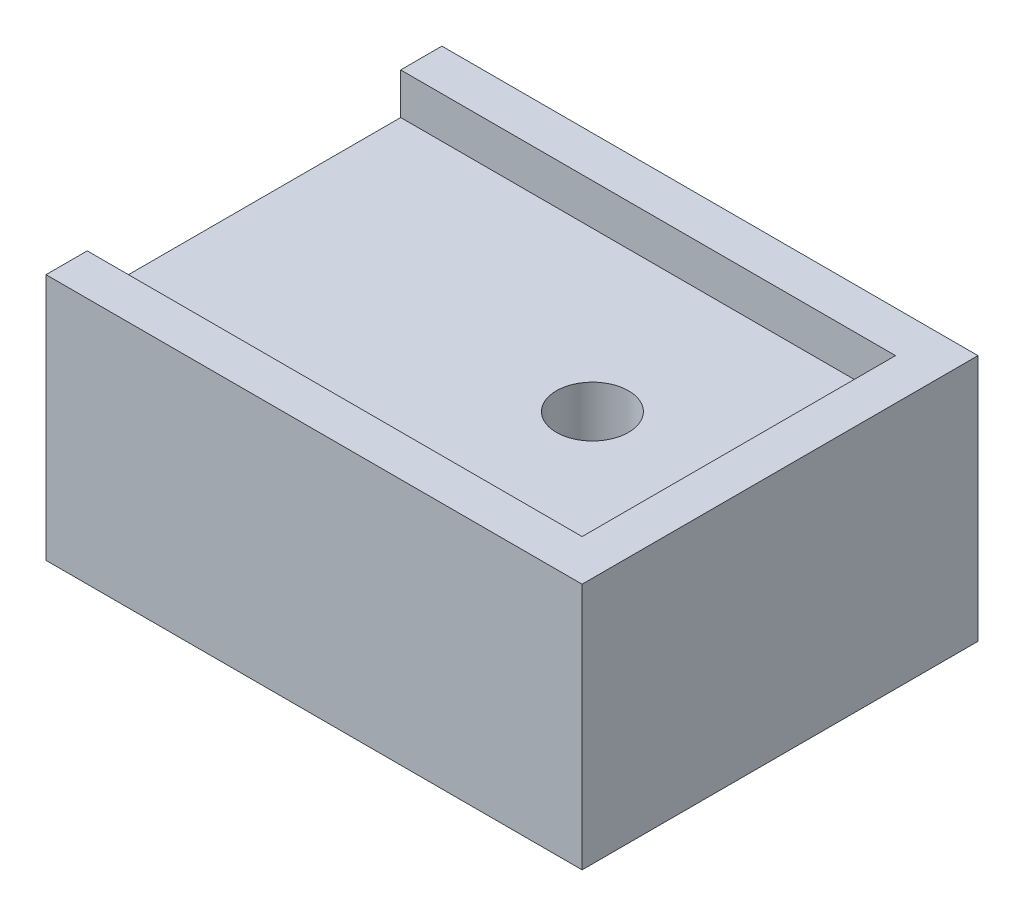
ISO-10303-21;
HEADER;
FILE_DESCRIPTION(('STEP AP214'),'2;1');
FILE_NAME('part.step','',(''),(''),'','','');
FILE_SCHEMA(('AUTOMOTIVE_DESIGN { 1 0 10303 214 1 1 1 1 }'));
ENDSEC;
DATA;
#1=APPLICATION_CONTEXT('core data for automotive mechanical design processes');
#2=APPLICATION_PROTOCOL_DEFINITION('international standard','automotive_design',2000,#1);
#3=PRODUCT_CONTEXT('',#1,'mechanical');
#4=PRODUCT('Part','Part','',(#3));
#5=PRODUCT_RELATED_PRODUCT_CATEGORY('part','',(#4));
#6=PRODUCT_DEFINITION_FORMATION('','',#4);
#7=PRODUCT_DEFINITION_CONTEXT('part definition',#1,'design');
#8=PRODUCT_DEFINITION('design','',#6,#7);
#9=PRODUCT_DEFINITION_SHAPE('','',#8);
#10=(LENGTH_UNIT() NAMED_UNIT(*) SI_UNIT(.MILLI.,.METRE.));
#11=(NAMED_UNIT(*) PLANE_ANGLE_UNIT() SI_UNIT($,.RADIAN.));
#12=(NAMED_UNIT(*) SI_UNIT($,.STERADIAN.) SOLID_ANGLE_UNIT());
#13=UNCERTAINTY_MEASURE_WITH_UNIT(LENGTH_MEASURE(1.E-05),#10,'distance_accuracy_value','');
#14=(GEOMETRIC_REPRESENTATION_CONTEXT(3) GLOBAL_UNCERTAINTY_ASSIGNED_CONTEXT((#13)) GLOBAL_UNIT_ASSIGNED_CONTEXT((#10,
#11,#12)) REPRESENTATION_CONTEXT('',''));
#15=CARTESIAN_POINT('',(0.,0.,0.));
#16=DIRECTION('',(0.,0.,1.));
#17=DIRECTION('',(1.,0.,0.));
#18=AXIS2_PLACEMENT_3D('',#15,#16,#17);
#19=CARTESIAN_POINT('',(-12.,10.,7.6));
#20=DIRECTION('',(1.,0.,0.));
#21=DIRECTION('',(0.,0.,-1.));
#22=AXIS2_PLACEMENT_3D('',#19,#20,#21);
#23=PLANE('',#22);
#24=DIRECTION('',(0.,0.,1.));
#25=VECTOR('',#24,1.);
#26=CARTESIAN_POINT('',(-12.,0.,7.6));
#27=LINE('',#26,#25);
#28=CARTESIAN_POINT('',(-12.,0.,-9.6));
#29=VERTEX_POINT('',#28);
#30=CARTESIAN_POINT('',(-12.,0.,9.6));
#31=VERTEX_POINT('',#30);
#32=EDGE_CURVE('E42',#29,#31,#27,.T.);
#33=ORIENTED_EDGE('',*,*,#32,.T.);
#34=DIRECTION('',(0.,-1.,0.));
#35=VECTOR('',#34,1.);
#36=CARTESIAN_POINT('',(-12.,12.,9.6));
#37=LINE('',#36,#35);
#38=CARTESIAN_POINT('',(-12.,12.,9.6));
#39=VERTEX_POINT('',#38);
#40=EDGE_CURVE('E165',#39,#31,#37,.T.);
#41=ORIENTED_EDGE('',*,*,#40,.F.);
#42=DIRECTION('',(0.,0.,-1.));
#43=VECTOR('',#42,1.);
#44=CARTESIAN_POINT('',(-12.,12.,9.6));
#45=LINE('',#44,#43);
#46=CARTESIAN_POINT('',(-12.,12.,7.6));
#47=VERTEX_POINT('',#46);
#48=EDGE_CURVE('E110',#39,#47,#45,.T.);
#49=ORIENTED_EDGE('',*,*,#48,.T.);
#50=DIRECTION('',(0.,-1.,0.));
#51=VECTOR('',#50,1.);
#52=CARTESIAN_POINT('',(-12.,12.,7.6));
#53=LINE('',#52,#51);
#54=CARTESIAN_POINT('',(-12.,10.,7.6));
#55=VERTEX_POINT('',#54);
#56=EDGE_CURVE('E126',#47,#55,#53,.T.);
#57=ORIENTED_EDGE('',*,*,#56,.T.);
#58=DIRECTION('',(0.,0.,1.));
#59=VECTOR('',#58,1.);
#60=CARTESIAN_POINT('',(-12.,10.,7.6));
#61=LINE('',#60,#59);
#62=CARTESIAN_POINT('',(-12.,10.,-7.6));
#63=VERTEX_POINT('',#62);
#64=EDGE_CURVE('E48',#63,#55,#61,.T.);
#65=ORIENTED_EDGE('',*,*,#64,.F.);
#66=DIRECTION('',(0.,-1.,0.));
#67=VECTOR('',#66,1.);
#68=CARTESIAN_POINT('',(-12.,12.,-7.6));
#69=LINE('',#68,#67);
#70=CARTESIAN_POINT('',(-12.,12.,-7.6));
#71=VERTEX_POINT('',#70);
#72=EDGE_CURVE('E179',#71,#63,#69,.T.);
#73=ORIENTED_EDGE('',*,*,#72,.F.);
#74=DIRECTION('',(0.,0.,-1.));
#75=VECTOR('',#74,1.);
#76=CARTESIAN_POINT('',(-12.,12.,-7.6));
#77=LINE('',#76,#75);
#78=CARTESIAN_POINT('',(-12.,12.,-9.6));
#79=VERTEX_POINT('',#78);
#80=EDGE_CURVE('E137',#71,#79,#77,.T.);
#81=ORIENTED_EDGE('',*,*,#80,.T.);
#82=DIRECTION('',(0.,-1.,0.));
#83=VECTOR('',#82,1.);
#84=CARTESIAN_POINT('',(-12.,12.,-9.6));
#85=LINE('',#84,#83);
#86=EDGE_CURVE('E175',#79,#29,#85,.T.);
#87=ORIENTED_EDGE('',*,*,#86,.T.);
#88=EDGE_LOOP('',(#33,#41,#49,#57,#65,#73,#81,#87));
#89=FACE_BOUND('',#88,.T.);
#90=ADVANCED_FACE('F39',(#89),#23,.F.);
#91=CARTESIAN_POINT('',(0.,10.,0.));
#92=DIRECTION('',(0.,-1.,0.));
#93=DIRECTION('',(0.,0.,-1.));
#94=AXIS2_PLACEMENT_3D('',#91,#92,#93);
#95=PLANE('',#94);
#96=CARTESIAN_POINT('',(4.99999999999999,10.,0.0999999999999812));
#97=DIRECTION('',(0.,1.,0.));
#98=DIRECTION('',(0.,0.,1.));
#99=AXIS2_PLACEMENT_3D('',#96,#97,#98);
#100=CIRCLE('',#99,1.75);
#101=CARTESIAN_POINT('',(4.99999999999999,10.,1.84999999999998));
#102=VERTEX_POINT('',#101);
#103=EDGE_CURVE('E164',#102,#102,#100,.T.);
#104=ORIENTED_EDGE('',*,*,#103,.F.);
#105=EDGE_LOOP('',(#104));
#106=FACE_BOUND('',#105,.T.);
#107=DIRECTION('',(0.,0.,-1.));
#108=VECTOR('',#107,1.);
#109=CARTESIAN_POINT('',(12.,10.,7.6));
#110=LINE('',#109,#108);
#111=CARTESIAN_POINT('',(12.,10.,7.6));
#112=VERTEX_POINT('',#111);
#113=CARTESIAN_POINT('',(12.,10.,-7.6));
#114=VERTEX_POINT('',#113);
#115=EDGE_CURVE('E105',#112,#114,#110,.T.);
#116=ORIENTED_EDGE('',*,*,#115,.T.);
#117=DIRECTION('',(-1.,0.,0.));
#118=VECTOR('',#117,1.);
#119=CARTESIAN_POINT('',(-12.,10.,-7.6));
#120=LINE('',#119,#118);
#121=EDGE_CURVE('E194',#114,#63,#120,.T.);
#122=ORIENTED_EDGE('',*,*,#121,.T.);
#123=ORIENTED_EDGE('',*,*,#64,.T.);
#124=DIRECTION('',(1.,0.,0.));
#125=VECTOR('',#124,1.);
#126=CARTESIAN_POINT('',(-12.,10.,7.6));
#127=LINE('',#126,#125);
#128=EDGE_CURVE('E11',#55,#112,#127,.T.);
#129=ORIENTED_EDGE('',*,*,#128,.T.);
#130=EDGE_LOOP('',(#116,#122,#123,#129));
#131=FACE_BOUND('',#130,.T.);
#132=ADVANCED_FACE('F216',(#106,#131),#95,.F.);
#133=CARTESIAN_POINT('',(0.,0.,0.));
#134=DIRECTION('',(0.,-1.,0.));
#135=DIRECTION('',(0.,0.,-1.));
#136=AXIS2_PLACEMENT_3D('',#133,#134,#135);
#137=PLANE('',#136);
#138=ORIENTED_EDGE('',*,*,#32,.F.);
#139=DIRECTION('',(1.,0.,0.));
#140=VECTOR('',#139,1.);
#141=CARTESIAN_POINT('',(14.,0.,-9.6));
#142=LINE('',#141,#140);
#143=CARTESIAN_POINT('',(14.,0.,-9.6));
#144=VERTEX_POINT('',#143);
#145=EDGE_CURVE('E155',#29,#144,#142,.T.);
#146=ORIENTED_EDGE('',*,*,#145,.T.);
#147=DIRECTION('',(0.,0.,1.));
#148=VECTOR('',#147,1.);
#149=CARTESIAN_POINT('',(14.,0.,9.6));
#150=LINE('',#149,#148);
#151=CARTESIAN_POINT('',(14.,0.,9.6));
#152=VERTEX_POINT('',#151);
#153=EDGE_CURVE('E132',#144,#152,#150,.T.);
#154=ORIENTED_EDGE('',*,*,#153,.T.);
#155=DIRECTION('',(-1.,0.,0.));
#156=VECTOR('',#155,1.);
#157=CARTESIAN_POINT('',(-12.,0.,9.6));
#158=LINE('',#157,#156);
#159=EDGE_CURVE('E128',#152,#31,#158,.T.);
#160=ORIENTED_EDGE('',*,*,#159,.T.);
#161=EDGE_LOOP('',(#138,#146,#154,#160));
#162=FACE_BOUND('',#161,.T.);
#163=CARTESIAN_POINT('',(4.99999999999999,0.,0.0999999999999812));
#164=DIRECTION('',(0.,1.,0.));
#165=DIRECTION('',(0.,0.,1.));
#166=AXIS2_PLACEMENT_3D('',#163,#164,#165);
#167=CIRCLE('',#166,1.75);
#168=CARTESIAN_POINT('',(4.99999999999999,0.,1.84999999999998));
#169=VERTEX_POINT('',#168);
#170=EDGE_CURVE('E185',#169,#169,#167,.T.);
#171=ORIENTED_EDGE('',*,*,#170,.T.);
#172=EDGE_LOOP('',(#171));
#173=FACE_BOUND('',#172,.T.);
#174=ADVANCED_FACE('F206',(#162,#173),#137,.T.);
#175=CARTESIAN_POINT('',(4.99999999999999,0.,0.0999999999999812));
#176=DIRECTION('',(0.,1.,0.));
#177=DIRECTION('',(0.,0.,1.));
#178=AXIS2_PLACEMENT_3D('',#175,#176,#177);
#179=CYLINDRICAL_SURFACE('',#178,1.75);
#180=ORIENTED_EDGE('',*,*,#170,.F.);
#181=EDGE_LOOP('',(#180));
#182=FACE_BOUND('',#181,.T.);
#183=ORIENTED_EDGE('',*,*,#103,.T.);
#184=EDGE_LOOP('',(#183));
#185=FACE_BOUND('',#184,.T.);
#186=ADVANCED_FACE('F224',(#182,#185),#179,.F.);
#187=CARTESIAN_POINT('',(-12.,12.,7.6));
#188=DIRECTION('',(0.,0.,-1.));
#189=DIRECTION('',(-1.,0.,0.));
#190=AXIS2_PLACEMENT_3D('',#187,#188,#189);
#191=PLANE('',#190);
#192=ORIENTED_EDGE('',*,*,#128,.F.);
#193=ORIENTED_EDGE('',*,*,#56,.F.);
#194=DIRECTION('',(1.,0.,0.));
#195=VECTOR('',#194,1.);
#196=CARTESIAN_POINT('',(-12.,12.,7.6));
#197=LINE('',#196,#195);
#198=CARTESIAN_POINT('',(12.,12.,7.6));
#199=VERTEX_POINT('',#198);
#200=EDGE_CURVE('E117',#47,#199,#197,.T.);
#201=ORIENTED_EDGE('',*,*,#200,.T.);
#202=DIRECTION('',(0.,-1.,0.));
#203=VECTOR('',#202,1.);
#204=CARTESIAN_POINT('',(12.,12.,7.6));
#205=LINE('',#204,#203);
#206=EDGE_CURVE('E100',#199,#112,#205,.T.);
#207=ORIENTED_EDGE('',*,*,#206,.T.);
#208=EDGE_LOOP('',(#192,#193,#201,#207));
#209=FACE_BOUND('',#208,.T.);
#210=ADVANCED_FACE('F124',(#209),#191,.T.);
#211=CARTESIAN_POINT('',(12.,12.,-7.6));
#212=DIRECTION('',(0.,0.,1.));
#213=DIRECTION('',(1.,0.,0.));
#214=AXIS2_PLACEMENT_3D('',#211,#212,#213);
#215=PLANE('',#214);
#216=ORIENTED_EDGE('',*,*,#121,.F.);
#217=DIRECTION('',(0.,-1.,0.));
#218=VECTOR('',#217,1.);
#219=CARTESIAN_POINT('',(12.,12.,-7.6));
#220=LINE('',#219,#218);
#221=CARTESIAN_POINT('',(12.,12.,-7.6));
#222=VERTEX_POINT('',#221);
#223=EDGE_CURVE('E109',#222,#114,#220,.T.);
#224=ORIENTED_EDGE('',*,*,#223,.F.);
#225=DIRECTION('',(-1.,0.,0.));
#226=VECTOR('',#225,1.);
#227=CARTESIAN_POINT('',(12.,12.,-7.6));
#228=LINE('',#227,#226);
#229=EDGE_CURVE('E121',#222,#71,#228,.T.);
#230=ORIENTED_EDGE('',*,*,#229,.T.);
#231=ORIENTED_EDGE('',*,*,#72,.T.);
#232=EDGE_LOOP('',(#216,#224,#230,#231));
#233=FACE_BOUND('',#232,.T.);
#234=ADVANCED_FACE('F215',(#233),#215,.T.);
#235=CARTESIAN_POINT('',(12.,12.,7.6));
#236=DIRECTION('',(-1.,0.,0.));
#237=DIRECTION('',(0.,0.,1.));
#238=AXIS2_PLACEMENT_3D('',#235,#236,#237);
#239=PLANE('',#238);
#240=ORIENTED_EDGE('',*,*,#115,.F.);
#241=ORIENTED_EDGE('',*,*,#206,.F.);
#242=DIRECTION('',(0.,0.,-1.));
#243=VECTOR('',#242,1.);
#244=CARTESIAN_POINT('',(12.,12.,7.6));
#245=LINE('',#244,#243);
#246=EDGE_CURVE('E104',#199,#222,#245,.T.);
#247=ORIENTED_EDGE('',*,*,#246,.T.);
#248=ORIENTED_EDGE('',*,*,#223,.T.);
#249=EDGE_LOOP('',(#240,#241,#247,#248));
#250=FACE_BOUND('',#249,.T.);
#251=ADVANCED_FACE('F102',(#250),#239,.T.);
#252=CARTESIAN_POINT('',(-12.,12.,9.6));
#253=DIRECTION('',(0.,0.,1.));
#254=DIRECTION('',(1.,0.,0.));
#255=AXIS2_PLACEMENT_3D('',#252,#253,#254);
#256=PLANE('',#255);
#257=ORIENTED_EDGE('',*,*,#159,.F.);
#258=DIRECTION('',(0.,-1.,0.));
#259=VECTOR('',#258,1.);
#260=CARTESIAN_POINT('',(14.,12.,9.6));
#261=LINE('',#260,#259);
#262=CARTESIAN_POINT('',(14.,12.,9.6));
#263=VERTEX_POINT('',#262);
#264=EDGE_CURVE('E169',#263,#152,#261,.T.);
#265=ORIENTED_EDGE('',*,*,#264,.F.);
#266=DIRECTION('',(-1.,0.,0.));
#267=VECTOR('',#266,1.);
#268=CARTESIAN_POINT('',(-12.,12.,9.6));
#269=LINE('',#268,#267);
#270=EDGE_CURVE('E149',#263,#39,#269,.T.);
#271=ORIENTED_EDGE('',*,*,#270,.T.);
#272=ORIENTED_EDGE('',*,*,#40,.T.);
#273=EDGE_LOOP('',(#257,#265,#271,#272));
#274=FACE_BOUND('',#273,.T.);
#275=ADVANCED_FACE('F204',(#274),#256,.T.);
#276=CARTESIAN_POINT('',(14.,12.,9.6));
#277=DIRECTION('',(1.,0.,0.));
#278=DIRECTION('',(0.,0.,-1.));
#279=AXIS2_PLACEMENT_3D('',#276,#277,#278);
#280=PLANE('',#279);
#281=ORIENTED_EDGE('',*,*,#153,.F.);
#282=DIRECTION('',(0.,-1.,0.));
#283=VECTOR('',#282,1.);
#284=CARTESIAN_POINT('',(14.,12.,-9.6));
#285=LINE('',#284,#283);
#286=CARTESIAN_POINT('',(14.,12.,-9.6));
#287=VERTEX_POINT('',#286);
#288=EDGE_CURVE('E172',#287,#144,#285,.T.);
#289=ORIENTED_EDGE('',*,*,#288,.F.);
#290=DIRECTION('',(0.,0.,1.));
#291=VECTOR('',#290,1.);
#292=CARTESIAN_POINT('',(14.,12.,9.6));
#293=LINE('',#292,#291);
#294=EDGE_CURVE('E145',#287,#263,#293,.T.);
#295=ORIENTED_EDGE('',*,*,#294,.T.);
#296=ORIENTED_EDGE('',*,*,#264,.T.);
#297=EDGE_LOOP('',(#281,#289,#295,#296));
#298=FACE_BOUND('',#297,.T.);
#299=ADVANCED_FACE('F210',(#298),#280,.T.);
#300=CARTESIAN_POINT('',(14.,12.,-9.6));
#301=DIRECTION('',(0.,0.,-1.));
#302=DIRECTION('',(-1.,0.,0.));
#303=AXIS2_PLACEMENT_3D('',#300,#301,#302);
#304=PLANE('',#303);
#305=ORIENTED_EDGE('',*,*,#145,.F.);
#306=ORIENTED_EDGE('',*,*,#86,.F.);
#307=DIRECTION('',(1.,0.,0.));
#308=VECTOR('',#307,1.);
#309=CARTESIAN_POINT('',(14.,12.,-9.6));
#310=LINE('',#309,#308);
#311=EDGE_CURVE('E141',#79,#287,#310,.T.);
#312=ORIENTED_EDGE('',*,*,#311,.T.);
#313=ORIENTED_EDGE('',*,*,#288,.T.);
#314=EDGE_LOOP('',(#305,#306,#312,#313));
#315=FACE_BOUND('',#314,.T.);
#316=ADVANCED_FACE('F236',(#315),#304,.T.);
#317=CARTESIAN_POINT('',(0.,12.,0.));
#318=DIRECTION('',(0.,1.,0.));
#319=DIRECTION('',(0.,0.,1.));
#320=AXIS2_PLACEMENT_3D('',#317,#318,#319);
#321=PLANE('',#320);
#322=ORIENTED_EDGE('',*,*,#200,.F.);
#323=ORIENTED_EDGE('',*,*,#48,.F.);
#324=ORIENTED_EDGE('',*,*,#270,.F.);
#325=ORIENTED_EDGE('',*,*,#294,.F.);
#326=ORIENTED_EDGE('',*,*,#311,.F.);
#327=ORIENTED_EDGE('',*,*,#80,.F.);
#328=ORIENTED_EDGE('',*,*,#229,.F.);
#329=ORIENTED_EDGE('',*,*,#246,.F.);
#330=EDGE_LOOP('',(#322,#323,#324,#325,#326,#327,#328,#329));
#331=FACE_BOUND('',#330,.T.);
#332=ADVANCED_FACE('F115',(#331),#321,.T.);
#333=CLOSED_SHELL('',(#90,#132,#174,#186,#210,#234,#251,#275,#299,#316,#332));
#334=MANIFOLD_SOLID_BREP('B2',#333);
#335=ADVANCED_BREP_SHAPE_REPRESENTATION('',(#18,#334),#14);
#336=SHAPE_DEFINITION_REPRESENTATION(#9,#335);
ENDSEC;
END-ISO-10303-21;
